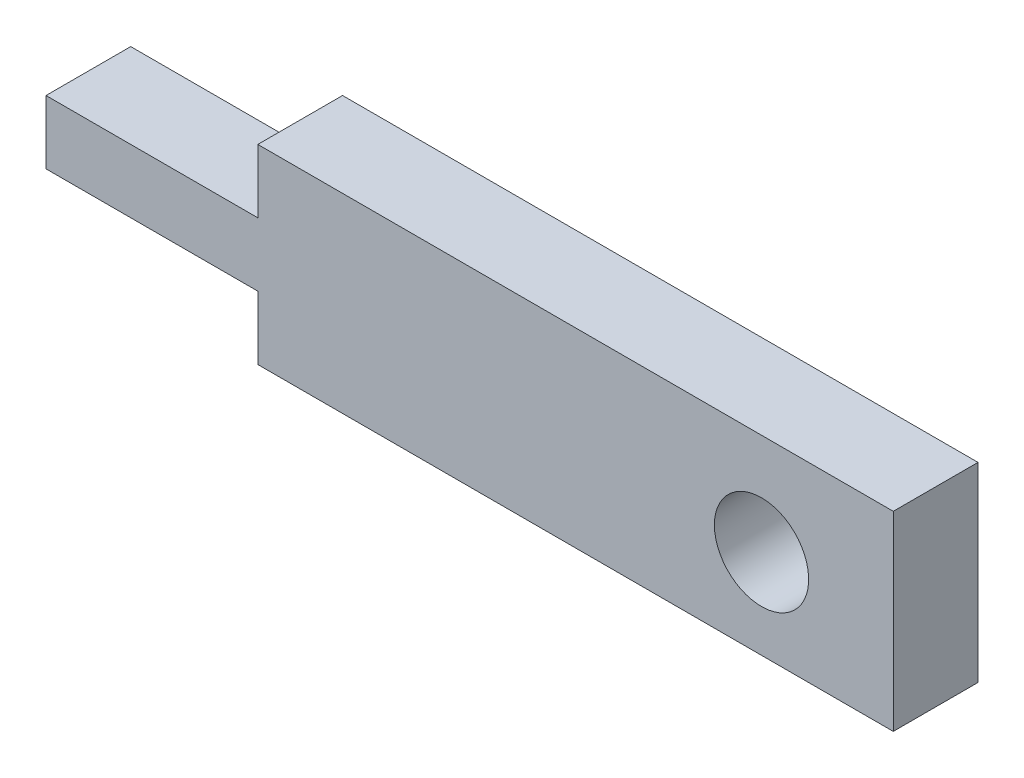
ISO-10303-21;
HEADER;
FILE_DESCRIPTION(('STEP AP214'),'2;1');
FILE_NAME('part.step','',(''),(''),'','','');
FILE_SCHEMA(('AUTOMOTIVE_DESIGN { 1 0 10303 214 1 1 1 1 }'));
ENDSEC;
DATA;
#1=APPLICATION_CONTEXT('core data for automotive mechanical design processes');
#2=APPLICATION_PROTOCOL_DEFINITION('international standard','automotive_design',2000,#1);
#3=PRODUCT_CONTEXT('',#1,'mechanical');
#4=PRODUCT('Part','Part','',(#3));
#5=PRODUCT_RELATED_PRODUCT_CATEGORY('part','',(#4));
#6=PRODUCT_DEFINITION_FORMATION('','',#4);
#7=PRODUCT_DEFINITION_CONTEXT('part definition',#1,'design');
#8=PRODUCT_DEFINITION('design','',#6,#7);
#9=PRODUCT_DEFINITION_SHAPE('','',#8);
#10=(LENGTH_UNIT() NAMED_UNIT(*) SI_UNIT(.MILLI.,.METRE.));
#11=(NAMED_UNIT(*) PLANE_ANGLE_UNIT() SI_UNIT($,.RADIAN.));
#12=(NAMED_UNIT(*) SI_UNIT($,.STERADIAN.) SOLID_ANGLE_UNIT());
#13=UNCERTAINTY_MEASURE_WITH_UNIT(LENGTH_MEASURE(1.E-05),#10,'distance_accuracy_value','');
#14=(GEOMETRIC_REPRESENTATION_CONTEXT(3) GLOBAL_UNCERTAINTY_ASSIGNED_CONTEXT((#13)) GLOBAL_UNIT_ASSIGNED_CONTEXT((#10,
#11,#12)) REPRESENTATION_CONTEXT('',''));
#15=CARTESIAN_POINT('',(0.,0.,0.));
#16=DIRECTION('',(0.,0.,1.));
#17=DIRECTION('',(1.,0.,0.));
#18=AXIS2_PLACEMENT_3D('',#15,#16,#17);
#19=CARTESIAN_POINT('',(175.,45.,10.));
#20=DIRECTION('',(-1.,0.,0.));
#21=DIRECTION('',(0.,0.,1.));
#22=AXIS2_PLACEMENT_3D('',#19,#20,#21);
#23=PLANE('',#22);
#24=DIRECTION('',(0.,0.,-1.));
#25=VECTOR('',#24,1.);
#26=CARTESIAN_POINT('',(175.,0.,10.));
#27=LINE('',#26,#25);
#28=CARTESIAN_POINT('',(175.,0.,10.));
#29=VERTEX_POINT('',#28);
#30=CARTESIAN_POINT('',(175.,0.,-10.));
#31=VERTEX_POINT('',#30);
#32=EDGE_CURVE('E100',#29,#31,#27,.T.);
#33=ORIENTED_EDGE('',*,*,#32,.T.);
#34=DIRECTION('',(0.,-1.,0.));
#35=VECTOR('',#34,1.);
#36=CARTESIAN_POINT('',(175.,45.,-10.));
#37=LINE('',#36,#35);
#38=CARTESIAN_POINT('',(175.,45.,-10.));
#39=VERTEX_POINT('',#38);
#40=EDGE_CURVE('E11',#39,#31,#37,.T.);
#41=ORIENTED_EDGE('',*,*,#40,.F.);
#42=DIRECTION('',(0.,0.,-1.));
#43=VECTOR('',#42,1.);
#44=CARTESIAN_POINT('',(175.,45.,10.));
#45=LINE('',#44,#43);
#46=CARTESIAN_POINT('',(175.,45.,10.));
#47=VERTEX_POINT('',#46);
#48=EDGE_CURVE('E94',#47,#39,#45,.T.);
#49=ORIENTED_EDGE('',*,*,#48,.F.);
#50=DIRECTION('',(0.,-1.,0.));
#51=VECTOR('',#50,1.);
#52=CARTESIAN_POINT('',(175.,45.,10.));
#53=LINE('',#52,#51);
#54=EDGE_CURVE('E53',#47,#29,#53,.T.);
#55=ORIENTED_EDGE('',*,*,#54,.T.);
#56=EDGE_LOOP('',(#33,#41,#49,#55));
#57=FACE_BOUND('',#56,.T.);
#58=ADVANCED_FACE('F45',(#57),#23,.F.);
#59=CARTESIAN_POINT('',(-175.,45.,-10.));
#60=DIRECTION('',(0.,0.,1.));
#61=DIRECTION('',(1.,0.,0.));
#62=AXIS2_PLACEMENT_3D('',#59,#60,#61);
#63=PLANE('',#62);
#64=CARTESIAN_POINT('',(143.9,21.1,-10.));
#65=DIRECTION('',(0.,0.,-1.));
#66=DIRECTION('',(-1.,0.,0.));
#67=AXIS2_PLACEMENT_3D('',#64,#65,#66);
#68=CIRCLE('',#67,11.125);
#69=CARTESIAN_POINT('',(132.775,21.1,-10.));
#70=VERTEX_POINT('',#69);
#71=EDGE_CURVE('E111',#70,#70,#68,.T.);
#72=ORIENTED_EDGE('',*,*,#71,.F.);
#73=EDGE_LOOP('',(#72));
#74=FACE_BOUND('',#73,.T.);
#75=DIRECTION('',(-1.,0.,0.));
#76=VECTOR('',#75,1.);
#77=CARTESIAN_POINT('',(-175.,0.,-10.));
#78=LINE('',#77,#76);
#79=CARTESIAN_POINT('',(25.,0.,-10.));
#80=VERTEX_POINT('',#79);
#81=EDGE_CURVE('E95',#31,#80,#78,.T.);
#82=ORIENTED_EDGE('',*,*,#81,.T.);
#83=DIRECTION('',(0.,1.,0.));
#84=VECTOR('',#83,1.);
#85=CARTESIAN_POINT('',(25.,0.,-10.));
#86=LINE('',#85,#84);
#87=CARTESIAN_POINT('',(25.,15.,-10.));
#88=VERTEX_POINT('',#87);
#89=EDGE_CURVE('E60',#80,#88,#86,.T.);
#90=ORIENTED_EDGE('',*,*,#89,.T.);
#91=DIRECTION('',(-1.,0.,0.));
#92=VECTOR('',#91,1.);
#93=CARTESIAN_POINT('',(0.,15.,-10.));
#94=LINE('',#93,#92);
#95=CARTESIAN_POINT('',(-25.,15.,-10.));
#96=VERTEX_POINT('',#95);
#97=EDGE_CURVE('E170',#88,#96,#94,.T.);
#98=ORIENTED_EDGE('',*,*,#97,.T.);
#99=DIRECTION('',(0.,1.,0.));
#100=VECTOR('',#99,1.);
#101=CARTESIAN_POINT('',(-25.,0.,-10.));
#102=LINE('',#101,#100);
#103=CARTESIAN_POINT('',(-25.,30.,-10.));
#104=VERTEX_POINT('',#103);
#105=EDGE_CURVE('E131',#96,#104,#102,.T.);
#106=ORIENTED_EDGE('',*,*,#105,.T.);
#107=DIRECTION('',(1.,0.,0.));
#108=VECTOR('',#107,1.);
#109=CARTESIAN_POINT('',(0.,30.,-10.));
#110=LINE('',#109,#108);
#111=CARTESIAN_POINT('',(25.,30.,-10.));
#112=VERTEX_POINT('',#111);
#113=EDGE_CURVE('E152',#104,#112,#110,.T.);
#114=ORIENTED_EDGE('',*,*,#113,.T.);
#115=DIRECTION('',(0.,1.,0.));
#116=VECTOR('',#115,1.);
#117=CARTESIAN_POINT('',(25.,0.,-10.));
#118=LINE('',#117,#116);
#119=CARTESIAN_POINT('',(25.,45.,-10.));
#120=VERTEX_POINT('',#119);
#121=EDGE_CURVE('E176',#112,#120,#118,.T.);
#122=ORIENTED_EDGE('',*,*,#121,.T.);
#123=DIRECTION('',(-1.,0.,0.));
#124=VECTOR('',#123,1.);
#125=CARTESIAN_POINT('',(-175.,45.,-10.));
#126=LINE('',#125,#124);
#127=EDGE_CURVE('E116',#39,#120,#126,.T.);
#128=ORIENTED_EDGE('',*,*,#127,.F.);
#129=ORIENTED_EDGE('',*,*,#40,.T.);
#130=EDGE_LOOP('',(#82,#90,#98,#106,#114,#122,#128,#129));
#131=FACE_BOUND('',#130,.T.);
#132=ADVANCED_FACE('F185',(#74,#131),#63,.F.);
#133=CARTESIAN_POINT('',(-175.,45.,10.));
#134=DIRECTION('',(0.,0.,-1.));
#135=DIRECTION('',(-1.,0.,0.));
#136=AXIS2_PLACEMENT_3D('',#133,#134,#135);
#137=PLANE('',#136);
#138=CARTESIAN_POINT('',(143.9,21.1,10.));
#139=DIRECTION('',(0.,0.,-1.));
#140=DIRECTION('',(-1.,0.,0.));
#141=AXIS2_PLACEMENT_3D('',#138,#139,#140);
#142=CIRCLE('',#141,11.125);
#143=CARTESIAN_POINT('',(132.775,21.1,10.));
#144=VERTEX_POINT('',#143);
#145=EDGE_CURVE('E105',#144,#144,#142,.T.);
#146=ORIENTED_EDGE('',*,*,#145,.T.);
#147=EDGE_LOOP('',(#146));
#148=FACE_BOUND('',#147,.T.);
#149=DIRECTION('',(-1.,0.,0.));
#150=VECTOR('',#149,1.);
#151=CARTESIAN_POINT('',(0.,15.,10.));
#152=LINE('',#151,#150);
#153=CARTESIAN_POINT('',(25.,15.,10.));
#154=VERTEX_POINT('',#153);
#155=CARTESIAN_POINT('',(-25.,15.,10.));
#156=VERTEX_POINT('',#155);
#157=EDGE_CURVE('E153',#154,#156,#152,.T.);
#158=ORIENTED_EDGE('',*,*,#157,.F.);
#159=DIRECTION('',(0.,1.,0.));
#160=VECTOR('',#159,1.);
#161=CARTESIAN_POINT('',(25.,0.,10.));
#162=LINE('',#161,#160);
#163=CARTESIAN_POINT('',(25.,0.,10.));
#164=VERTEX_POINT('',#163);
#165=EDGE_CURVE('E90',#164,#154,#162,.T.);
#166=ORIENTED_EDGE('',*,*,#165,.F.);
#167=DIRECTION('',(1.,0.,0.));
#168=VECTOR('',#167,1.);
#169=CARTESIAN_POINT('',(-175.,0.,10.));
#170=LINE('',#169,#168);
#171=EDGE_CURVE('E83',#164,#29,#170,.T.);
#172=ORIENTED_EDGE('',*,*,#171,.T.);
#173=ORIENTED_EDGE('',*,*,#54,.F.);
#174=DIRECTION('',(1.,0.,0.));
#175=VECTOR('',#174,1.);
#176=CARTESIAN_POINT('',(-175.,45.,10.));
#177=LINE('',#176,#175);
#178=CARTESIAN_POINT('',(25.,45.,10.));
#179=VERTEX_POINT('',#178);
#180=EDGE_CURVE('E69',#179,#47,#177,.T.);
#181=ORIENTED_EDGE('',*,*,#180,.F.);
#182=DIRECTION('',(0.,1.,0.));
#183=VECTOR('',#182,1.);
#184=CARTESIAN_POINT('',(25.,0.,10.));
#185=LINE('',#184,#183);
#186=CARTESIAN_POINT('',(25.,30.,10.));
#187=VERTEX_POINT('',#186);
#188=EDGE_CURVE('E159',#187,#179,#185,.T.);
#189=ORIENTED_EDGE('',*,*,#188,.F.);
#190=DIRECTION('',(1.,0.,0.));
#191=VECTOR('',#190,1.);
#192=CARTESIAN_POINT('',(0.,30.,10.));
#193=LINE('',#192,#191);
#194=CARTESIAN_POINT('',(-25.,30.,10.));
#195=VERTEX_POINT('',#194);
#196=EDGE_CURVE('E163',#195,#187,#193,.T.);
#197=ORIENTED_EDGE('',*,*,#196,.F.);
#198=DIRECTION('',(0.,1.,0.));
#199=VECTOR('',#198,1.);
#200=CARTESIAN_POINT('',(-25.,0.,10.));
#201=LINE('',#200,#199);
#202=EDGE_CURVE('E148',#156,#195,#201,.T.);
#203=ORIENTED_EDGE('',*,*,#202,.F.);
#204=EDGE_LOOP('',(#158,#166,#172,#173,#181,#189,#197,#203));
#205=FACE_BOUND('',#204,.T.);
#206=ADVANCED_FACE('F86',(#148,#205),#137,.F.);
#207=CARTESIAN_POINT('',(0.,45.,0.));
#208=DIRECTION('',(0.,-1.,0.));
#209=DIRECTION('',(0.,0.,-1.));
#210=AXIS2_PLACEMENT_3D('',#207,#208,#209);
#211=PLANE('',#210);
#212=ORIENTED_EDGE('',*,*,#127,.T.);
#213=DIRECTION('',(0.,0.,1.));
#214=VECTOR('',#213,1.);
#215=CARTESIAN_POINT('',(25.,45.,-10.));
#216=LINE('',#215,#214);
#217=EDGE_CURVE('E130',#120,#179,#216,.T.);
#218=ORIENTED_EDGE('',*,*,#217,.T.);
#219=ORIENTED_EDGE('',*,*,#180,.T.);
#220=ORIENTED_EDGE('',*,*,#48,.T.);
#221=EDGE_LOOP('',(#212,#218,#219,#220));
#222=FACE_BOUND('',#221,.T.);
#223=ADVANCED_FACE('F221',(#222),#211,.F.);
#224=CARTESIAN_POINT('',(0.,0.,0.));
#225=DIRECTION('',(0.,-1.,0.));
#226=DIRECTION('',(0.,0.,-1.));
#227=AXIS2_PLACEMENT_3D('',#224,#225,#226);
#228=PLANE('',#227);
#229=DIRECTION('',(0.,0.,1.));
#230=VECTOR('',#229,1.);
#231=CARTESIAN_POINT('',(25.,0.,-10.));
#232=LINE('',#231,#230);
#233=EDGE_CURVE('E134',#80,#164,#232,.T.);
#234=ORIENTED_EDGE('',*,*,#233,.F.);
#235=ORIENTED_EDGE('',*,*,#81,.F.);
#236=ORIENTED_EDGE('',*,*,#32,.F.);
#237=ORIENTED_EDGE('',*,*,#171,.F.);
#238=EDGE_LOOP('',(#234,#235,#236,#237));
#239=FACE_BOUND('',#238,.T.);
#240=ADVANCED_FACE('F102',(#239),#228,.T.);
#241=CARTESIAN_POINT('',(143.9,21.1,10.));
#242=DIRECTION('',(0.,0.,-1.));
#243=DIRECTION('',(-1.,0.,0.));
#244=AXIS2_PLACEMENT_3D('',#241,#242,#243);
#245=CYLINDRICAL_SURFACE('',#244,11.125);
#246=ORIENTED_EDGE('',*,*,#145,.F.);
#247=EDGE_LOOP('',(#246));
#248=FACE_BOUND('',#247,.T.);
#249=ORIENTED_EDGE('',*,*,#71,.T.);
#250=EDGE_LOOP('',(#249));
#251=FACE_BOUND('',#250,.T.);
#252=ADVANCED_FACE('F247',(#248,#251),#245,.F.);
#253=CARTESIAN_POINT('',(0.,30.,-10.));
#254=DIRECTION('',(0.,-1.,0.));
#255=DIRECTION('',(0.,0.,-1.));
#256=AXIS2_PLACEMENT_3D('',#253,#254,#255);
#257=PLANE('',#256);
#258=ORIENTED_EDGE('',*,*,#196,.T.);
#259=DIRECTION('',(0.,0.,1.));
#260=VECTOR('',#259,1.);
#261=CARTESIAN_POINT('',(25.,30.,-10.));
#262=LINE('',#261,#260);
#263=EDGE_CURVE('E126',#112,#187,#262,.T.);
#264=ORIENTED_EDGE('',*,*,#263,.F.);
#265=ORIENTED_EDGE('',*,*,#113,.F.);
#266=DIRECTION('',(0.,0.,1.));
#267=VECTOR('',#266,1.);
#268=CARTESIAN_POINT('',(-25.,30.,-10.));
#269=LINE('',#268,#267);
#270=EDGE_CURVE('E124',#104,#195,#269,.T.);
#271=ORIENTED_EDGE('',*,*,#270,.T.);
#272=EDGE_LOOP('',(#258,#264,#265,#271));
#273=FACE_BOUND('',#272,.T.);
#274=ADVANCED_FACE('F193',(#273),#257,.F.);
#275=CARTESIAN_POINT('',(-25.,0.,-10.));
#276=DIRECTION('',(1.,0.,0.));
#277=DIRECTION('',(0.,1.,0.));
#278=AXIS2_PLACEMENT_3D('',#275,#276,#277);
#279=PLANE('',#278);
#280=ORIENTED_EDGE('',*,*,#202,.T.);
#281=ORIENTED_EDGE('',*,*,#270,.F.);
#282=ORIENTED_EDGE('',*,*,#105,.F.);
#283=DIRECTION('',(0.,0.,1.));
#284=VECTOR('',#283,1.);
#285=CARTESIAN_POINT('',(-25.,15.,-10.));
#286=LINE('',#285,#284);
#287=EDGE_CURVE('E141',#96,#156,#286,.T.);
#288=ORIENTED_EDGE('',*,*,#287,.T.);
#289=EDGE_LOOP('',(#280,#281,#282,#288));
#290=FACE_BOUND('',#289,.T.);
#291=ADVANCED_FACE('F211',(#290),#279,.F.);
#292=CARTESIAN_POINT('',(0.,15.,-10.));
#293=DIRECTION('',(0.,1.,0.));
#294=DIRECTION('',(-1.,0.,0.));
#295=AXIS2_PLACEMENT_3D('',#292,#293,#294);
#296=PLANE('',#295);
#297=ORIENTED_EDGE('',*,*,#157,.T.);
#298=ORIENTED_EDGE('',*,*,#287,.F.);
#299=ORIENTED_EDGE('',*,*,#97,.F.);
#300=DIRECTION('',(0.,0.,1.));
#301=VECTOR('',#300,1.);
#302=CARTESIAN_POINT('',(25.,15.,-10.));
#303=LINE('',#302,#301);
#304=EDGE_CURVE('E137',#88,#154,#303,.T.);
#305=ORIENTED_EDGE('',*,*,#304,.T.);
#306=EDGE_LOOP('',(#297,#298,#299,#305));
#307=FACE_BOUND('',#306,.T.);
#308=ADVANCED_FACE('F216',(#307),#296,.F.);
#309=CARTESIAN_POINT('',(25.,0.,-10.));
#310=DIRECTION('',(1.,0.,0.));
#311=DIRECTION('',(0.,0.,-1.));
#312=AXIS2_PLACEMENT_3D('',#309,#310,#311);
#313=PLANE('',#312);
#314=ORIENTED_EDGE('',*,*,#165,.T.);
#315=ORIENTED_EDGE('',*,*,#304,.F.);
#316=ORIENTED_EDGE('',*,*,#89,.F.);
#317=ORIENTED_EDGE('',*,*,#233,.T.);
#318=EDGE_LOOP('',(#314,#315,#316,#317));
#319=FACE_BOUND('',#318,.T.);
#320=ADVANCED_FACE('F223',(#319),#313,.F.);
#321=CARTESIAN_POINT('',(25.,0.,-10.));
#322=DIRECTION('',(1.,0.,0.));
#323=DIRECTION('',(0.,1.,0.));
#324=AXIS2_PLACEMENT_3D('',#321,#322,#323);
#325=PLANE('',#324);
#326=ORIENTED_EDGE('',*,*,#188,.T.);
#327=ORIENTED_EDGE('',*,*,#217,.F.);
#328=ORIENTED_EDGE('',*,*,#121,.F.);
#329=ORIENTED_EDGE('',*,*,#263,.T.);
#330=EDGE_LOOP('',(#326,#327,#328,#329));
#331=FACE_BOUND('',#330,.T.);
#332=ADVANCED_FACE('F220',(#331),#325,.F.);
#333=CLOSED_SHELL('',(#58,#132,#206,#223,#240,#252,#274,#291,#308,#320,#332));
#334=MANIFOLD_SOLID_BREP('B2',#333);
#335=ADVANCED_BREP_SHAPE_REPRESENTATION('',(#18,#334),#14);
#336=SHAPE_DEFINITION_REPRESENTATION(#9,#335);
ENDSEC;
END-ISO-10303-21;
